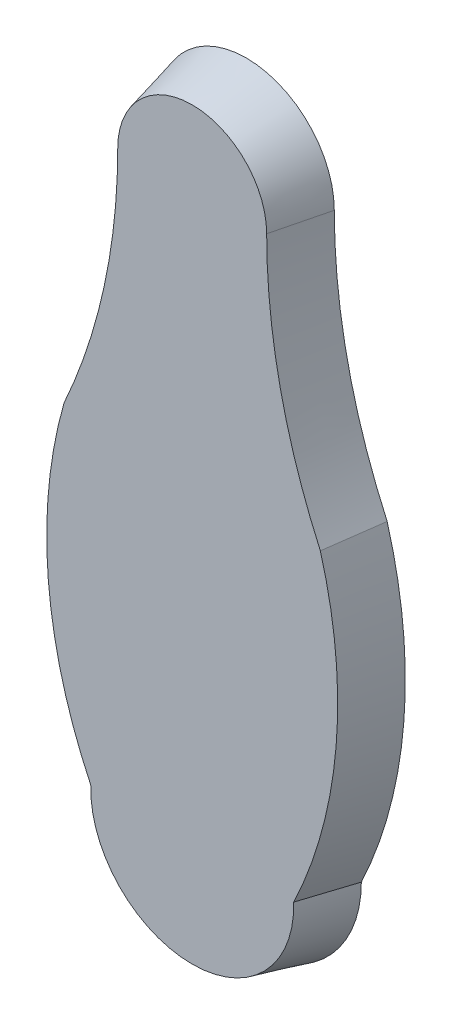
ISO-10303-21;
HEADER;
FILE_DESCRIPTION(('STEP AP214'),'2;1');
FILE_NAME('part.step','',(''),(''),'','','');
FILE_SCHEMA(('AUTOMOTIVE_DESIGN { 1 0 10303 214 1 1 1 1 }'));
ENDSEC;
DATA;
#1=APPLICATION_CONTEXT('core data for automotive mechanical design processes');
#2=APPLICATION_PROTOCOL_DEFINITION('international standard','automotive_design',2000,#1);
#3=PRODUCT_CONTEXT('',#1,'mechanical');
#4=PRODUCT('Part','Part','',(#3));
#5=PRODUCT_RELATED_PRODUCT_CATEGORY('part','',(#4));
#6=PRODUCT_DEFINITION_FORMATION('','',#4);
#7=PRODUCT_DEFINITION_CONTEXT('part definition',#1,'design');
#8=PRODUCT_DEFINITION('design','',#6,#7);
#9=PRODUCT_DEFINITION_SHAPE('','',#8);
#10=(LENGTH_UNIT() NAMED_UNIT(*) SI_UNIT(.MILLI.,.METRE.));
#11=(NAMED_UNIT(*) PLANE_ANGLE_UNIT() SI_UNIT($,.RADIAN.));
#12=(NAMED_UNIT(*) SI_UNIT($,.STERADIAN.) SOLID_ANGLE_UNIT());
#13=UNCERTAINTY_MEASURE_WITH_UNIT(LENGTH_MEASURE(1.E-05),#10,'distance_accuracy_value','');
#14=(GEOMETRIC_REPRESENTATION_CONTEXT(3) GLOBAL_UNCERTAINTY_ASSIGNED_CONTEXT((#13)) GLOBAL_UNIT_ASSIGNED_CONTEXT((#10,
#11,#12)) REPRESENTATION_CONTEXT('',''));
#15=CARTESIAN_POINT('',(0.,0.,0.));
#16=DIRECTION('',(0.,0.,1.));
#17=DIRECTION('',(1.,0.,0.));
#18=AXIS2_PLACEMENT_3D('',#15,#16,#17);
#19=CARTESIAN_POINT('',(0.,210.,0.));
#20=DIRECTION('',(0.,0.,-1.));
#21=DIRECTION('',(1.,0.,0.));
#22=AXIS2_PLACEMENT_3D('',#19,#20,#21);
#23=CONICAL_SURFACE('',#22,32.5,0.244346095279207);
#24=CARTESIAN_POINT('',(0.,210.,0.));
#25=DIRECTION('',(0.,0.,1.));
#26=DIRECTION('',(1.,0.,0.));
#27=AXIS2_PLACEMENT_3D('',#24,#25,#26);
#28=CIRCLE('',#27,32.5);
#29=CARTESIAN_POINT('',(32.5,210.,0.));
#30=VERTEX_POINT('',#29);
#31=CARTESIAN_POINT('',(-32.5,210.,0.));
#32=VERTEX_POINT('',#31);
#33=EDGE_CURVE('E96',#30,#32,#28,.T.);
#34=ORIENTED_EDGE('',*,*,#33,.T.);
#35=DIRECTION('',(-0.241921895599668,0.,-0.970295726275996));
#36=VECTOR('',#35,1.);
#37=CARTESIAN_POINT('',(-32.5,210.,0.));
#38=LINE('',#37,#36);
#39=CARTESIAN_POINT('',(-27.5134399431364,210.,20.));
#40=VERTEX_POINT('',#39);
#41=EDGE_CURVE('E11',#40,#32,#38,.T.);
#42=ORIENTED_EDGE('',*,*,#41,.F.);
#43=CARTESIAN_POINT('',(0.,210.,20.));
#44=DIRECTION('',(0.,0.,1.));
#45=DIRECTION('',(1.,0.,0.));
#46=AXIS2_PLACEMENT_3D('',#43,#44,#45);
#47=CIRCLE('',#46,27.5134399431364);
#48=CARTESIAN_POINT('',(27.5134399431364,210.,20.));
#49=VERTEX_POINT('',#48);
#50=EDGE_CURVE('E118',#49,#40,#47,.T.);
#51=ORIENTED_EDGE('',*,*,#50,.F.);
#52=DIRECTION('',(0.241921895599668,0.,-0.970295726275996));
#53=VECTOR('',#52,1.);
#54=CARTESIAN_POINT('',(32.5,210.,0.));
#55=LINE('',#54,#53);
#56=EDGE_CURVE('E52',#49,#30,#55,.T.);
#57=ORIENTED_EDGE('',*,*,#56,.T.);
#58=EDGE_LOOP('',(#34,#42,#51,#57));
#59=FACE_BOUND('',#58,.T.);
#60=ADVANCED_FACE('F36',(#59),#23,.T.);
#61=CARTESIAN_POINT('',(-248.624681520739,210.,0.));
#62=DIRECTION('',(0.,0.,1.));
#63=DIRECTION('',(-1.,0.,0.));
#64=AXIS2_PLACEMENT_3D('',#61,#62,#63);
#65=CONICAL_SURFACE('',#64,216.124681520739,0.244346095279207);
#66=CARTESIAN_POINT('',(-248.624681520739,210.,0.));
#67=DIRECTION('',(0.,0.,-1.));
#68=DIRECTION('',(-1.,0.,0.));
#69=AXIS2_PLACEMENT_3D('',#66,#67,#68);
#70=CIRCLE('',#69,216.124681520739);
#71=CARTESIAN_POINT('',(-52.0404530661374,120.197332526534,0.));
#72=VERTEX_POINT('',#71);
#73=EDGE_CURVE('E92',#32,#72,#70,.T.);
#74=ORIENTED_EDGE('',*,*,#73,.T.);
#75=CARTESIAN_POINT('',(-47.3499351287047,118.464992397383,20.));
#76=CARTESIAN_POINT('',(-48.1319748333198,118.752960442517,16.6666684859358));
#77=CARTESIAN_POINT('',(-48.9138711804318,119.041306142521,13.3333360621588));
#78=CARTESIAN_POINT('',(-50.477377159576,119.618752852238,6.66666939549209));
#79=CARTESIAN_POINT('',(-51.2589867916082,119.907853861952,3.33333515260245));
#80=CARTESIAN_POINT('',(-52.0404530661373,120.197332526534,0.));
#81=B_SPLINE_CURVE_WITH_KNOTS('',3,(#75,#76,#77,#78,#79,#80),.UNSPECIFIED.,.F.,.F.,(4,2,4),(0.,
10.3077879144687,20.6155758279695),.UNSPECIFIED.);
#82=CARTESIAN_POINT('',(-47.3499351287047,118.464992397383,20.));
#83=VERTEX_POINT('',#82);
#84=EDGE_CURVE('E44',#83,#72,#81,.T.);
#85=ORIENTED_EDGE('',*,*,#84,.F.);
#86=CARTESIAN_POINT('',(-248.624681520739,210.,20.));
#87=DIRECTION('',(0.,0.,1.));
#88=DIRECTION('',(1.,0.,0.));
#89=AXIS2_PLACEMENT_3D('',#86,#87,#88);
#90=CIRCLE('',#89,221.111241577603);
#91=EDGE_CURVE('E105',#40,#83,#90,.F.);
#92=ORIENTED_EDGE('',*,*,#91,.F.);
#93=ORIENTED_EDGE('',*,*,#41,.T.);
#94=EDGE_LOOP('',(#74,#85,#92,#93));
#95=FACE_BOUND('',#94,.T.);
#96=ADVANCED_FACE('F104',(#95),#65,.F.);
#97=CARTESIAN_POINT('',(112.292287070769,72.7636617349118,0.));
#98=DIRECTION('',(0.,0.,-1.));
#99=DIRECTION('',(1.,0.,0.));
#100=AXIS2_PLACEMENT_3D('',#97,#98,#99);
#101=CONICAL_SURFACE('',#100,171.041523045348,0.244346095279207);
#102=CARTESIAN_POINT('',(112.292287070769,72.7636617349118,0.));
#103=DIRECTION('',(0.,0.,1.));
#104=DIRECTION('',(1.,0.,0.));
#105=AXIS2_PLACEMENT_3D('',#102,#103,#104);
#106=CIRCLE('',#105,171.041523045348);
#107=CARTESIAN_POINT('',(-42.5,0.,0.));
#108=VERTEX_POINT('',#107);
#109=EDGE_CURVE('E98',#72,#108,#106,.T.);
#110=ORIENTED_EDGE('',*,*,#109,.T.);
#111=CARTESIAN_POINT('',(-37.4976250958047,1.08916873889014,20.));
#112=CARTESIAN_POINT('',(-37.915862509152,1.00062172703946,18.3335567892864));
#113=CARTESIAN_POINT('',(-38.3337288516656,0.911475105917242,16.6670523792829));
#114=CARTESIAN_POINT('',(-39.1687616766304,0.732051787210869,13.3339299951858));
#115=CARTESIAN_POINT('',(-39.5859281594547,0.641775090229478,11.6673120211533));
#116=CARTESIAN_POINT('',(-40.4196039529336,0.460160675946074,8.33396972483335));
#117=CARTESIAN_POINT('',(-40.8361132636508,0.368822958745282,6.66724540255601));
#118=CARTESIAN_POINT('',(-41.6685121726463,0.18514686140536,3.33369619406944));
#119=CARTESIAN_POINT('',(-42.084401770594,0.0928084807326465,1.66687130780706));
#120=CARTESIAN_POINT('',(-42.5,1.07182036016783E-13,0.));
#121=B_SPLINE_CURVE_WITH_KNOTS('',3,(#111,#112,#113,#114,#115,#116,#117,#118,#119,#120),
.UNSPECIFIED.,.F.,.F.,(4,2,2,2,4),(0.,5.16121712599822,10.3224314991951,15.4836453800145,
20.6448620130833),.UNSPECIFIED.);
#122=CARTESIAN_POINT('',(-37.4976250958047,1.08916873889014,20.));
#123=VERTEX_POINT('',#122);
#124=EDGE_CURVE('E150',#123,#108,#121,.T.);
#125=ORIENTED_EDGE('',*,*,#124,.F.);
#126=CARTESIAN_POINT('',(112.292287070769,72.7636617349118,20.));
#127=DIRECTION('',(0.,0.,1.));
#128=DIRECTION('',(1.,0.,0.));
#129=AXIS2_PLACEMENT_3D('',#126,#127,#128);
#130=CIRCLE('',#129,166.054962988484);
#131=EDGE_CURVE('E223',#83,#123,#130,.T.);
#132=ORIENTED_EDGE('',*,*,#131,.F.);
#133=ORIENTED_EDGE('',*,*,#84,.T.);
#134=EDGE_LOOP('',(#110,#125,#132,#133));
#135=FACE_BOUND('',#134,.T.);
#136=ADVANCED_FACE('F146',(#135),#101,.T.);
#137=CARTESIAN_POINT('',(0.,0.,0.));
#138=DIRECTION('',(0.,0.,-1.));
#139=DIRECTION('',(1.,0.,0.));
#140=AXIS2_PLACEMENT_3D('',#137,#138,#139);
#141=CONICAL_SURFACE('',#140,42.5,0.244346095279207);
#142=CARTESIAN_POINT('',(0.,0.,0.));
#143=DIRECTION('',(0.,0.,1.));
#144=DIRECTION('',(1.,0.,0.));
#145=AXIS2_PLACEMENT_3D('',#142,#143,#144);
#146=CIRCLE('',#145,42.5);
#147=CARTESIAN_POINT('',(42.5,0.,0.));
#148=VERTEX_POINT('',#147);
#149=EDGE_CURVE('E111',#108,#148,#146,.T.);
#150=ORIENTED_EDGE('',*,*,#149,.T.);
#151=CARTESIAN_POINT('',(37.4976250958047,1.08916873889011,20.));
#152=CARTESIAN_POINT('',(37.915862509152,1.00062172703947,18.3335567892864));
#153=CARTESIAN_POINT('',(38.3337288516656,0.911475105917273,16.6670523792829));
#154=CARTESIAN_POINT('',(39.1687616766304,0.732051787210918,13.3339299951858));
#155=CARTESIAN_POINT('',(39.5859281594547,0.641775090229525,11.6673120211533));
#156=CARTESIAN_POINT('',(40.4196039529336,0.460160675946117,8.33396972483334));
#157=CARTESIAN_POINT('',(40.8361132636508,0.368822958745322,6.667245402556));
#158=CARTESIAN_POINT('',(41.6685121726464,0.185146861405384,3.33369619406944));
#159=CARTESIAN_POINT('',(42.084401770594,0.0928084807326576,1.66687130780706));
#160=CARTESIAN_POINT('',(42.5,0.,0.));
#161=B_SPLINE_CURVE_WITH_KNOTS('',3,(#151,#152,#153,#154,#155,#156,#157,#158,#159,#160),
.UNSPECIFIED.,.F.,.F.,(4,2,2,2,4),(0.,5.16121712599822,10.3224314991951,15.4836453800145,
20.6448620130833),.UNSPECIFIED.);
#162=CARTESIAN_POINT('',(37.4976250958047,1.08916873889011,20.));
#163=VERTEX_POINT('',#162);
#164=EDGE_CURVE('E128',#163,#148,#161,.T.);
#165=ORIENTED_EDGE('',*,*,#164,.F.);
#166=CARTESIAN_POINT('',(0.,0.,20.));
#167=DIRECTION('',(0.,0.,1.));
#168=DIRECTION('',(1.,0.,0.));
#169=AXIS2_PLACEMENT_3D('',#166,#167,#168);
#170=CIRCLE('',#169,37.5134399431364);
#171=EDGE_CURVE('E224',#123,#163,#170,.T.);
#172=ORIENTED_EDGE('',*,*,#171,.F.);
#173=ORIENTED_EDGE('',*,*,#124,.T.);
#174=EDGE_LOOP('',(#150,#165,#172,#173));
#175=FACE_BOUND('',#174,.T.);
#176=ADVANCED_FACE('F141',(#175),#141,.T.);
#177=CARTESIAN_POINT('',(-112.292287070769,72.7636617349118,0.));
#178=DIRECTION('',(0.,0.,-1.));
#179=DIRECTION('',(-1.,0.,0.));
#180=AXIS2_PLACEMENT_3D('',#177,#178,#179);
#181=CONICAL_SURFACE('',#180,171.041523045348,0.244346095279207);
#182=CARTESIAN_POINT('',(-112.292287070769,72.7636617349118,0.));
#183=DIRECTION('',(0.,0.,-1.));
#184=DIRECTION('',(-1.,0.,0.));
#185=AXIS2_PLACEMENT_3D('',#182,#183,#184);
#186=CIRCLE('',#185,171.041523045348);
#187=CARTESIAN_POINT('',(52.0404530661374,120.197332526534,0.));
#188=VERTEX_POINT('',#187);
#189=EDGE_CURVE('E114',#188,#148,#186,.T.);
#190=ORIENTED_EDGE('',*,*,#189,.F.);
#191=CARTESIAN_POINT('',(47.3499351287047,118.464992397382,20.));
#192=CARTESIAN_POINT('',(48.1319748333199,118.752960442517,16.6666684859358));
#193=CARTESIAN_POINT('',(48.9138711804318,119.041306142521,13.3333360621588));
#194=CARTESIAN_POINT('',(50.477377159576,119.618752852238,6.66666939549209));
#195=CARTESIAN_POINT('',(51.2589867916083,119.907853861952,3.33333515260245));
#196=CARTESIAN_POINT('',(52.0404530661373,120.197332526534,0.));
#197=B_SPLINE_CURVE_WITH_KNOTS('',3,(#191,#192,#193,#194,#195,#196),.UNSPECIFIED.,.F.,.F.,(4,2,
4),(0.,10.3077879144687,20.6155758279695),.UNSPECIFIED.);
#198=CARTESIAN_POINT('',(47.3499351287047,118.464992397382,20.));
#199=VERTEX_POINT('',#198);
#200=EDGE_CURVE('E60',#199,#188,#197,.T.);
#201=ORIENTED_EDGE('',*,*,#200,.F.);
#202=CARTESIAN_POINT('',(-112.292287070769,72.7636617349118,20.));
#203=DIRECTION('',(0.,0.,1.));
#204=DIRECTION('',(1.,0.,0.));
#205=AXIS2_PLACEMENT_3D('',#202,#203,#204);
#206=CIRCLE('',#205,166.054962988484);
#207=EDGE_CURVE('E227',#199,#163,#206,.F.);
#208=ORIENTED_EDGE('',*,*,#207,.T.);
#209=ORIENTED_EDGE('',*,*,#164,.T.);
#210=EDGE_LOOP('',(#190,#201,#208,#209));
#211=FACE_BOUND('',#210,.T.);
#212=ADVANCED_FACE('F138',(#211),#181,.T.);
#213=CARTESIAN_POINT('',(248.624681520739,210.,0.));
#214=DIRECTION('',(0.,0.,1.));
#215=DIRECTION('',(1.,0.,0.));
#216=AXIS2_PLACEMENT_3D('',#213,#214,#215);
#217=CONICAL_SURFACE('',#216,216.124681520739,0.244346095279207);
#218=CARTESIAN_POINT('',(248.624681520739,210.,0.));
#219=DIRECTION('',(0.,0.,1.));
#220=DIRECTION('',(1.,0.,0.));
#221=AXIS2_PLACEMENT_3D('',#218,#219,#220);
#222=CIRCLE('',#221,216.124681520739);
#223=EDGE_CURVE('E117',#30,#188,#222,.T.);
#224=ORIENTED_EDGE('',*,*,#223,.F.);
#225=ORIENTED_EDGE('',*,*,#56,.F.);
#226=CARTESIAN_POINT('',(248.624681520739,210.,20.));
#227=DIRECTION('',(0.,0.,1.));
#228=DIRECTION('',(1.,0.,0.));
#229=AXIS2_PLACEMENT_3D('',#226,#227,#228);
#230=CIRCLE('',#229,221.111241577603);
#231=EDGE_CURVE('E39',#49,#199,#230,.T.);
#232=ORIENTED_EDGE('',*,*,#231,.T.);
#233=ORIENTED_EDGE('',*,*,#200,.T.);
#234=EDGE_LOOP('',(#224,#225,#232,#233));
#235=FACE_BOUND('',#234,.T.);
#236=ADVANCED_FACE('F135',(#235),#217,.F.);
#237=CARTESIAN_POINT('',(-124.31234076037,210.,20.));
#238=DIRECTION('',(0.,0.,1.));
#239=DIRECTION('',(1.,0.,0.));
#240=AXIS2_PLACEMENT_3D('',#237,#238,#239);
#241=PLANE('',#240);
#242=ORIENTED_EDGE('',*,*,#50,.T.);
#243=ORIENTED_EDGE('',*,*,#91,.T.);
#244=ORIENTED_EDGE('',*,*,#131,.T.);
#245=ORIENTED_EDGE('',*,*,#171,.T.);
#246=ORIENTED_EDGE('',*,*,#207,.F.);
#247=ORIENTED_EDGE('',*,*,#231,.F.);
#248=EDGE_LOOP('',(#242,#243,#244,#245,#246,#247));
#249=FACE_BOUND('',#248,.T.);
#250=ADVANCED_FACE('F203',(#249),#241,.T.);
#251=CARTESIAN_POINT('',(-124.31234076037,210.,0.));
#252=DIRECTION('',(0.,0.,1.));
#253=DIRECTION('',(1.,0.,0.));
#254=AXIS2_PLACEMENT_3D('',#251,#252,#253);
#255=PLANE('',#254);
#256=ORIENTED_EDGE('',*,*,#33,.F.);
#257=ORIENTED_EDGE('',*,*,#223,.T.);
#258=ORIENTED_EDGE('',*,*,#189,.T.);
#259=ORIENTED_EDGE('',*,*,#149,.F.);
#260=ORIENTED_EDGE('',*,*,#109,.F.);
#261=ORIENTED_EDGE('',*,*,#73,.F.);
#262=EDGE_LOOP('',(#256,#257,#258,#259,#260,#261));
#263=FACE_BOUND('',#262,.T.);
#264=ADVANCED_FACE('F93',(#263),#255,.F.);
#265=CLOSED_SHELL('',(#60,#96,#136,#176,#212,#236,#250,#264));
#266=MANIFOLD_SOLID_BREP('B2',#265);
#267=ADVANCED_BREP_SHAPE_REPRESENTATION('',(#18,#266),#14);
#268=SHAPE_DEFINITION_REPRESENTATION(#9,#267);
ENDSEC;
END-ISO-10303-21;
